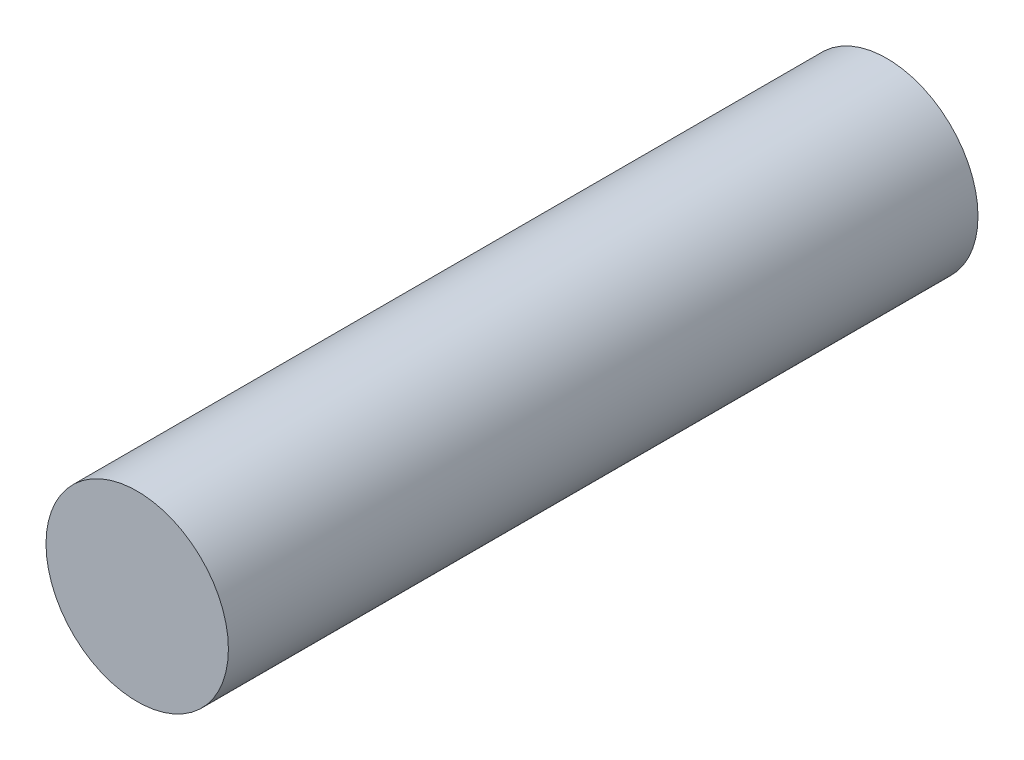
ISO-10303-21;
HEADER;
FILE_DESCRIPTION(('STEP AP214'),'2;1');
FILE_NAME('part.step','',(''),(''),'','','');
FILE_SCHEMA(('AUTOMOTIVE_DESIGN { 1 0 10303 214 1 1 1 1 }'));
ENDSEC;
DATA;
#1=APPLICATION_CONTEXT('core data for automotive mechanical design processes');
#2=APPLICATION_PROTOCOL_DEFINITION('international standard','automotive_design',2000,#1);
#3=PRODUCT_CONTEXT('',#1,'mechanical');
#4=PRODUCT('Part','Part','',(#3));
#5=PRODUCT_RELATED_PRODUCT_CATEGORY('part','',(#4));
#6=PRODUCT_DEFINITION_FORMATION('','',#4);
#7=PRODUCT_DEFINITION_CONTEXT('part definition',#1,'design');
#8=PRODUCT_DEFINITION('design','',#6,#7);
#9=PRODUCT_DEFINITION_SHAPE('','',#8);
#10=(LENGTH_UNIT() NAMED_UNIT(*) SI_UNIT(.MILLI.,.METRE.));
#11=(NAMED_UNIT(*) PLANE_ANGLE_UNIT() SI_UNIT($,.RADIAN.));
#12=(NAMED_UNIT(*) SI_UNIT($,.STERADIAN.) SOLID_ANGLE_UNIT());
#13=UNCERTAINTY_MEASURE_WITH_UNIT(LENGTH_MEASURE(1.E-05),#10,'distance_accuracy_value','');
#14=(GEOMETRIC_REPRESENTATION_CONTEXT(3) GLOBAL_UNCERTAINTY_ASSIGNED_CONTEXT((#13)) GLOBAL_UNIT_ASSIGNED_CONTEXT((#10,
#11,#12)) REPRESENTATION_CONTEXT('',''));
#15=CARTESIAN_POINT('',(0.,0.,0.));
#16=DIRECTION('',(0.,0.,1.));
#17=DIRECTION('',(1.,0.,0.));
#18=AXIS2_PLACEMENT_3D('',#15,#16,#17);
#19=CARTESIAN_POINT('',(0.,0.,600.));
#20=DIRECTION('',(0.,0.,-1.));
#21=DIRECTION('',(-1.,0.,0.));
#22=AXIS2_PLACEMENT_3D('',#19,#20,#21);
#23=CYLINDRICAL_SURFACE('',#22,73.);
#24=CARTESIAN_POINT('',(0.,0.,600.));
#25=DIRECTION('',(0.,0.,1.));
#26=DIRECTION('',(1.,0.,0.));
#27=AXIS2_PLACEMENT_3D('',#24,#25,#26);
#28=CIRCLE('',#27,73.);
#29=CARTESIAN_POINT('',(73.,0.,600.));
#30=VERTEX_POINT('',#29);
#31=EDGE_CURVE('E10',#30,#30,#28,.T.);
#32=ORIENTED_EDGE('',*,*,#31,.F.);
#33=EDGE_LOOP('',(#32));
#34=FACE_BOUND('',#33,.T.);
#35=CARTESIAN_POINT('',(0.,0.,0.));
#36=DIRECTION('',(0.,0.,1.));
#37=DIRECTION('',(1.,0.,0.));
#38=AXIS2_PLACEMENT_3D('',#35,#36,#37);
#39=CIRCLE('',#38,73.);
#40=CARTESIAN_POINT('',(73.,0.,0.));
#41=VERTEX_POINT('',#40);
#42=EDGE_CURVE('E38',#41,#41,#39,.T.);
#43=ORIENTED_EDGE('',*,*,#42,.T.);
#44=EDGE_LOOP('',(#43));
#45=FACE_BOUND('',#44,.T.);
#46=ADVANCED_FACE('F35',(#34,#45),#23,.T.);
#47=CARTESIAN_POINT('',(0.,0.,600.));
#48=DIRECTION('',(0.,0.,1.));
#49=DIRECTION('',(1.,0.,0.));
#50=AXIS2_PLACEMENT_3D('',#47,#48,#49);
#51=PLANE('',#50);
#52=ORIENTED_EDGE('',*,*,#31,.T.);
#53=EDGE_LOOP('',(#52));
#54=FACE_BOUND('',#53,.T.);
#55=ADVANCED_FACE('F50',(#54),#51,.T.);
#56=CARTESIAN_POINT('',(0.,0.,0.));
#57=DIRECTION('',(0.,0.,1.));
#58=DIRECTION('',(1.,0.,0.));
#59=AXIS2_PLACEMENT_3D('',#56,#57,#58);
#60=PLANE('',#59);
#61=ORIENTED_EDGE('',*,*,#42,.F.);
#62=EDGE_LOOP('',(#61));
#63=FACE_BOUND('',#62,.T.);
#64=ADVANCED_FACE('F48',(#63),#60,.F.);
#65=CLOSED_SHELL('',(#46,#55,#64));
#66=MANIFOLD_SOLID_BREP('B2',#65);
#67=ADVANCED_BREP_SHAPE_REPRESENTATION('',(#18,#66),#14);
#68=SHAPE_DEFINITION_REPRESENTATION(#9,#67);
ENDSEC;
END-ISO-10303-21;
